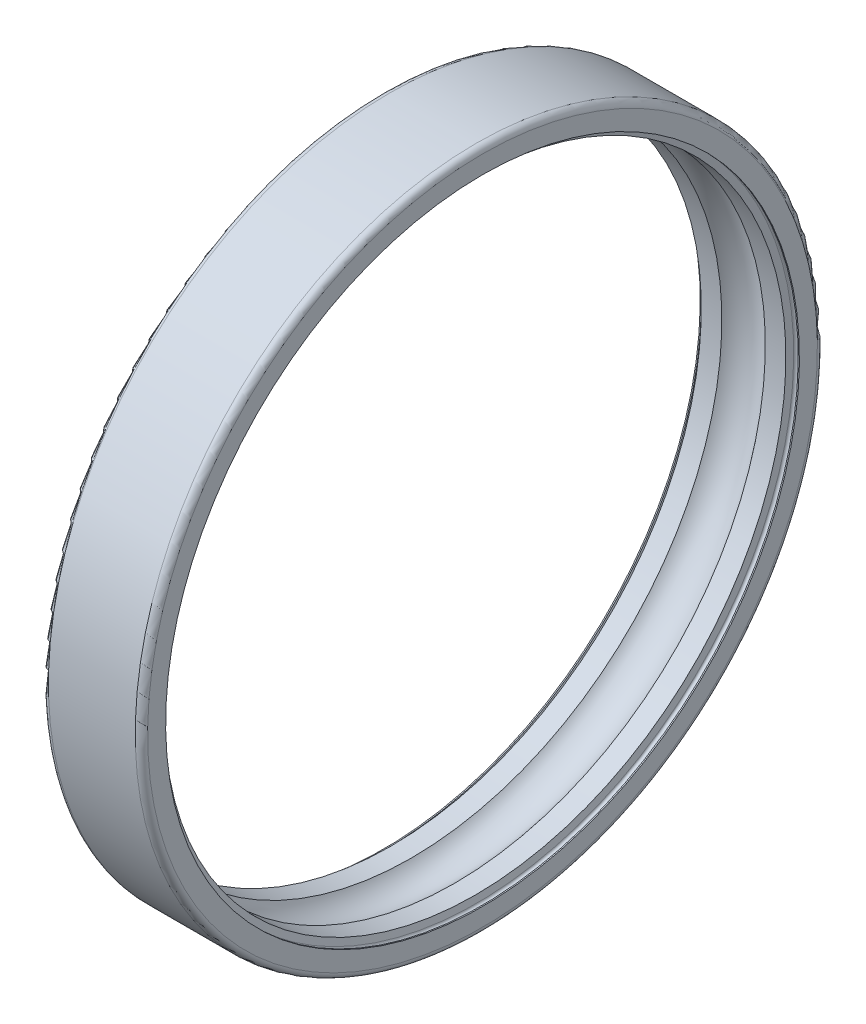
ISO-10303-21;
HEADER;
FILE_DESCRIPTION(('STEP AP214'),'2;1');
FILE_NAME('part.step','',(''),(''),'','','');
FILE_SCHEMA(('AUTOMOTIVE_DESIGN { 1 0 10303 214 1 1 1 1 }'));
ENDSEC;
DATA;
#1=APPLICATION_CONTEXT('core data for automotive mechanical design processes');
#2=APPLICATION_PROTOCOL_DEFINITION('international standard','automotive_design',2000,#1);
#3=PRODUCT_CONTEXT('',#1,'mechanical');
#4=PRODUCT('Part','Part','',(#3));
#5=PRODUCT_RELATED_PRODUCT_CATEGORY('part','',(#4));
#6=PRODUCT_DEFINITION_FORMATION('','',#4);
#7=PRODUCT_DEFINITION_CONTEXT('part definition',#1,'design');
#8=PRODUCT_DEFINITION('design','',#6,#7);
#9=PRODUCT_DEFINITION_SHAPE('','',#8);
#10=(LENGTH_UNIT() NAMED_UNIT(*) SI_UNIT(.MILLI.,.METRE.));
#11=(NAMED_UNIT(*) PLANE_ANGLE_UNIT() SI_UNIT($,.RADIAN.));
#12=(NAMED_UNIT(*) SI_UNIT($,.STERADIAN.) SOLID_ANGLE_UNIT());
#13=UNCERTAINTY_MEASURE_WITH_UNIT(LENGTH_MEASURE(1.E-05),#10,'distance_accuracy_value','');
#14=(GEOMETRIC_REPRESENTATION_CONTEXT(3) GLOBAL_UNCERTAINTY_ASSIGNED_CONTEXT((#13)) GLOBAL_UNIT_ASSIGNED_CONTEXT((#10,
#11,#12)) REPRESENTATION_CONTEXT('',''));
#15=CARTESIAN_POINT('',(0.,0.,0.));
#16=DIRECTION('',(0.,0.,1.));
#17=DIRECTION('',(1.,0.,0.));
#18=AXIS2_PLACEMENT_3D('',#15,#16,#17);
#19=CARTESIAN_POINT('',(15.4,0.,0.));
#20=DIRECTION('',(1.,0.,0.));
#21=DIRECTION('',(0.,0.,-1.));
#22=AXIS2_PLACEMENT_3D('',#19,#20,#21);
#23=TOROIDAL_SURFACE('',#22,51.1,0.4);
#24=CARTESIAN_POINT('',(15.8,0.,0.));
#25=DIRECTION('',(1.,0.,0.));
#26=DIRECTION('',(0.,1.,0.));
#27=AXIS2_PLACEMENT_3D('',#24,#25,#26);
#28=CIRCLE('',#27,51.1);
#29=CARTESIAN_POINT('',(15.8,51.1,0.));
#30=VERTEX_POINT('',#29);
#31=EDGE_CURVE('E10',#30,#30,#28,.T.);
#32=ORIENTED_EDGE('',*,*,#31,.T.);
#33=EDGE_LOOP('',(#32));
#34=FACE_BOUND('',#33,.T.);
#35=CARTESIAN_POINT('',(15.0060768987951,0.,0.));
#36=DIRECTION('',(1.,0.,0.));
#37=DIRECTION('',(0.,1.,0.));
#38=AXIS2_PLACEMENT_3D('',#35,#36,#37);
#39=CIRCLE('',#38,51.1694592710668);
#40=CARTESIAN_POINT('',(15.0060768987951,51.1694592710668,0.));
#41=VERTEX_POINT('',#40);
#42=EDGE_CURVE('E76',#41,#41,#39,.T.);
#43=ORIENTED_EDGE('',*,*,#42,.F.);
#44=EDGE_LOOP('',(#43));
#45=FACE_BOUND('',#44,.T.);
#46=ADVANCED_FACE('F15',(#34,#45),#23,.F.);
#47=CARTESIAN_POINT('',(15.9,0.,0.));
#48=DIRECTION('',(-1.,0.,0.));
#49=DIRECTION('',(0.,1.,0.));
#50=AXIS2_PLACEMENT_3D('',#47,#48,#49);
#51=CYLINDRICAL_SURFACE('',#50,51.1);
#52=CARTESIAN_POINT('',(16.,0.,0.));
#53=DIRECTION('',(1.,0.,0.));
#54=DIRECTION('',(0.,1.,0.));
#55=AXIS2_PLACEMENT_3D('',#52,#53,#54);
#56=CIRCLE('',#55,51.1);
#57=CARTESIAN_POINT('',(16.,51.1,0.));
#58=VERTEX_POINT('',#57);
#59=EDGE_CURVE('E25',#58,#58,#56,.T.);
#60=ORIENTED_EDGE('',*,*,#59,.T.);
#61=EDGE_LOOP('',(#60));
#62=FACE_BOUND('',#61,.T.);
#63=ORIENTED_EDGE('',*,*,#31,.F.);
#64=EDGE_LOOP('',(#63));
#65=FACE_BOUND('',#64,.T.);
#66=ADVANCED_FACE('F115',(#62,#65),#51,.F.);
#67=CARTESIAN_POINT('',(16.,52.55,0.));
#68=DIRECTION('',(1.,0.,0.));
#69=DIRECTION('',(0.,1.,0.));
#70=AXIS2_PLACEMENT_3D('',#67,#68,#69);
#71=PLANE('',#70);
#72=CARTESIAN_POINT('',(16.,0.,0.));
#73=DIRECTION('',(1.,0.,0.));
#74=DIRECTION('',(0.,1.,0.));
#75=AXIS2_PLACEMENT_3D('',#72,#73,#74);
#76=CIRCLE('',#75,54.);
#77=CARTESIAN_POINT('',(16.,54.,0.));
#78=VERTEX_POINT('',#77);
#79=EDGE_CURVE('E89',#78,#78,#76,.T.);
#80=ORIENTED_EDGE('',*,*,#79,.T.);
#81=EDGE_LOOP('',(#80));
#82=FACE_BOUND('',#81,.T.);
#83=ORIENTED_EDGE('',*,*,#59,.F.);
#84=EDGE_LOOP('',(#83));
#85=FACE_BOUND('',#84,.T.);
#86=ADVANCED_FACE('F120',(#82,#85),#71,.T.);
#87=CARTESIAN_POINT('',(15.,0.,0.));
#88=DIRECTION('',(1.,0.,0.));
#89=DIRECTION('',(0.,0.,-1.));
#90=AXIS2_PLACEMENT_3D('',#87,#88,#89);
#91=TOROIDAL_SURFACE('',#90,54.,1.);
#92=CARTESIAN_POINT('',(15.,0.,0.));
#93=DIRECTION('',(1.,0.,0.));
#94=DIRECTION('',(0.,1.,0.));
#95=AXIS2_PLACEMENT_3D('',#92,#93,#94);
#96=CIRCLE('',#95,55.);
#97=CARTESIAN_POINT('',(15.,55.,0.));
#98=VERTEX_POINT('',#97);
#99=EDGE_CURVE('E19',#98,#98,#96,.T.);
#100=ORIENTED_EDGE('',*,*,#99,.T.);
#101=EDGE_LOOP('',(#100));
#102=FACE_BOUND('',#101,.T.);
#103=ORIENTED_EDGE('',*,*,#79,.F.);
#104=EDGE_LOOP('',(#103));
#105=FACE_BOUND('',#104,.T.);
#106=ADVANCED_FACE('F133',(#102,#105),#91,.T.);
#107=CARTESIAN_POINT('',(8.,0.,0.));
#108=DIRECTION('',(-1.,0.,0.));
#109=DIRECTION('',(0.,1.,0.));
#110=AXIS2_PLACEMENT_3D('',#107,#108,#109);
#111=CYLINDRICAL_SURFACE('',#110,55.);
#112=CARTESIAN_POINT('',(1.,0.,0.));
#113=DIRECTION('',(1.,0.,0.));
#114=DIRECTION('',(0.,1.,0.));
#115=AXIS2_PLACEMENT_3D('',#112,#113,#114);
#116=CIRCLE('',#115,55.);
#117=CARTESIAN_POINT('',(1.,55.,0.));
#118=VERTEX_POINT('',#117);
#119=EDGE_CURVE('E83',#118,#118,#116,.T.);
#120=ORIENTED_EDGE('',*,*,#119,.T.);
#121=EDGE_LOOP('',(#120));
#122=FACE_BOUND('',#121,.T.);
#123=ORIENTED_EDGE('',*,*,#99,.F.);
#124=EDGE_LOOP('',(#123));
#125=FACE_BOUND('',#124,.T.);
#126=ADVANCED_FACE('F17',(#122,#125),#111,.T.);
#127=CARTESIAN_POINT('',(1.,0.,0.));
#128=DIRECTION('',(1.,0.,0.));
#129=DIRECTION('',(0.,0.,-1.));
#130=AXIS2_PLACEMENT_3D('',#127,#128,#129);
#131=TOROIDAL_SURFACE('',#130,54.,1.);
#132=CARTESIAN_POINT('',(0.,0.,0.));
#133=DIRECTION('',(1.,0.,0.));
#134=DIRECTION('',(0.,1.,0.));
#135=AXIS2_PLACEMENT_3D('',#132,#133,#134);
#136=CIRCLE('',#135,54.);
#137=CARTESIAN_POINT('',(0.,54.,0.));
#138=VERTEX_POINT('',#137);
#139=EDGE_CURVE('E85',#138,#138,#136,.T.);
#140=ORIENTED_EDGE('',*,*,#139,.T.);
#141=EDGE_LOOP('',(#140));
#142=FACE_BOUND('',#141,.T.);
#143=ORIENTED_EDGE('',*,*,#119,.F.);
#144=EDGE_LOOP('',(#143));
#145=FACE_BOUND('',#144,.T.);
#146=ADVANCED_FACE('F126',(#142,#145),#131,.T.);
#147=CARTESIAN_POINT('',(0.,52.55,0.));
#148=DIRECTION('',(-1.,0.,0.));
#149=DIRECTION('',(0.,-1.,0.));
#150=AXIS2_PLACEMENT_3D('',#147,#148,#149);
#151=PLANE('',#150);
#152=CARTESIAN_POINT('',(0.,0.,0.));
#153=DIRECTION('',(1.,0.,0.));
#154=DIRECTION('',(0.,1.,0.));
#155=AXIS2_PLACEMENT_3D('',#152,#153,#154);
#156=CIRCLE('',#155,51.1);
#157=CARTESIAN_POINT('',(0.,51.1,0.));
#158=VERTEX_POINT('',#157);
#159=EDGE_CURVE('E88',#158,#158,#156,.T.);
#160=ORIENTED_EDGE('',*,*,#159,.T.);
#161=EDGE_LOOP('',(#160));
#162=FACE_BOUND('',#161,.T.);
#163=ORIENTED_EDGE('',*,*,#139,.F.);
#164=EDGE_LOOP('',(#163));
#165=FACE_BOUND('',#164,.T.);
#166=ADVANCED_FACE('F110',(#162,#165),#151,.T.);
#167=CARTESIAN_POINT('',(0.1,0.,0.));
#168=DIRECTION('',(-1.,0.,0.));
#169=DIRECTION('',(0.,1.,0.));
#170=AXIS2_PLACEMENT_3D('',#167,#168,#169);
#171=CYLINDRICAL_SURFACE('',#170,51.1);
#172=CARTESIAN_POINT('',(0.2,0.,0.));
#173=DIRECTION('',(1.,0.,0.));
#174=DIRECTION('',(0.,1.,0.));
#175=AXIS2_PLACEMENT_3D('',#172,#173,#174);
#176=CIRCLE('',#175,51.1);
#177=CARTESIAN_POINT('',(0.2,51.1,0.));
#178=VERTEX_POINT('',#177);
#179=EDGE_CURVE('E80',#178,#178,#176,.T.);
#180=ORIENTED_EDGE('',*,*,#179,.T.);
#181=EDGE_LOOP('',(#180));
#182=FACE_BOUND('',#181,.T.);
#183=ORIENTED_EDGE('',*,*,#159,.F.);
#184=EDGE_LOOP('',(#183));
#185=FACE_BOUND('',#184,.T.);
#186=ADVANCED_FACE('F95',(#182,#185),#171,.F.);
#187=CARTESIAN_POINT('',(0.6,0.,0.));
#188=DIRECTION('',(1.,0.,0.));
#189=DIRECTION('',(0.,0.,-1.));
#190=AXIS2_PLACEMENT_3D('',#187,#188,#189);
#191=TOROIDAL_SURFACE('',#190,51.1,0.4);
#192=CARTESIAN_POINT('',(0.993923101204883,0.,0.));
#193=DIRECTION('',(1.,0.,0.));
#194=DIRECTION('',(0.,1.,0.));
#195=AXIS2_PLACEMENT_3D('',#192,#193,#194);
#196=CIRCLE('',#195,51.1694592710668);
#197=CARTESIAN_POINT('',(0.993923101204883,51.1694592710668,0.));
#198=VERTEX_POINT('',#197);
#199=EDGE_CURVE('E74',#198,#198,#196,.T.);
#200=ORIENTED_EDGE('',*,*,#199,.T.);
#201=EDGE_LOOP('',(#200));
#202=FACE_BOUND('',#201,.T.);
#203=ORIENTED_EDGE('',*,*,#179,.F.);
#204=EDGE_LOOP('',(#203));
#205=FACE_BOUND('',#204,.T.);
#206=ADVANCED_FACE('F98',(#202,#205),#191,.F.);
#207=CARTESIAN_POINT('',(1.08821036333382,0.,0.));
#208=DIRECTION('',(-1.,0.,0.));
#209=DIRECTION('',(0.,1.,0.));
#210=AXIS2_PLACEMENT_3D('',#207,#208,#209);
#211=CONICAL_SURFACE('',#210,50.6347296355334,1.39626340159546);
#212=CARTESIAN_POINT('',(1.18249762546276,0.,0.));
#213=DIRECTION('',(1.,0.,0.));
#214=DIRECTION('',(0.,1.,0.));
#215=AXIS2_PLACEMENT_3D('',#212,#213,#214);
#216=CIRCLE('',#215,50.1);
#217=CARTESIAN_POINT('',(1.18249762546276,50.1,0.));
#218=VERTEX_POINT('',#217);
#219=EDGE_CURVE('E71',#218,#218,#216,.T.);
#220=ORIENTED_EDGE('',*,*,#219,.T.);
#221=EDGE_LOOP('',(#220));
#222=FACE_BOUND('',#221,.T.);
#223=ORIENTED_EDGE('',*,*,#199,.F.);
#224=EDGE_LOOP('',(#223));
#225=FACE_BOUND('',#224,.T.);
#226=ADVANCED_FACE('F100',(#222,#225),#211,.F.);
#227=CARTESIAN_POINT('',(2.83785280426667,0.,0.));
#228=DIRECTION('',(-1.,0.,0.));
#229=DIRECTION('',(0.,1.,0.));
#230=AXIS2_PLACEMENT_3D('',#227,#228,#229);
#231=CYLINDRICAL_SURFACE('',#230,50.1);
#232=CARTESIAN_POINT('',(4.49320798307058,0.,0.));
#233=DIRECTION('',(1.,0.,0.));
#234=DIRECTION('',(0.,1.,0.));
#235=AXIS2_PLACEMENT_3D('',#232,#233,#234);
#236=CIRCLE('',#235,50.1);
#237=CARTESIAN_POINT('',(4.49320798307058,50.1,0.));
#238=VERTEX_POINT('',#237);
#239=EDGE_CURVE('E67',#238,#238,#236,.T.);
#240=ORIENTED_EDGE('',*,*,#239,.T.);
#241=EDGE_LOOP('',(#240));
#242=FACE_BOUND('',#241,.T.);
#243=ORIENTED_EDGE('',*,*,#219,.F.);
#244=EDGE_LOOP('',(#243));
#245=FACE_BOUND('',#244,.T.);
#246=ADVANCED_FACE('F68',(#242,#245),#231,.F.);
#247=CARTESIAN_POINT('',(8.,0.,0.));
#248=DIRECTION('',(1.,0.,0.));
#249=DIRECTION('',(0.,0.,-1.));
#250=AXIS2_PLACEMENT_3D('',#247,#248,#249);
#251=TOROIDAL_SURFACE('',#250,47.5,4.3655);
#252=CARTESIAN_POINT('',(11.5067920169294,0.,0.));
#253=DIRECTION('',(1.,0.,0.));
#254=DIRECTION('',(0.,1.,0.));
#255=AXIS2_PLACEMENT_3D('',#252,#253,#254);
#256=CIRCLE('',#255,50.1);
#257=CARTESIAN_POINT('',(11.5067920169294,50.1,0.));
#258=VERTEX_POINT('',#257);
#259=EDGE_CURVE('E72',#258,#258,#256,.T.);
#260=ORIENTED_EDGE('',*,*,#259,.T.);
#261=EDGE_LOOP('',(#260));
#262=FACE_BOUND('',#261,.T.);
#263=ORIENTED_EDGE('',*,*,#239,.F.);
#264=EDGE_LOOP('',(#263));
#265=FACE_BOUND('',#264,.T.);
#266=ADVANCED_FACE('F131',(#262,#265),#251,.F.);
#267=CARTESIAN_POINT('',(13.1621471957333,0.,0.));
#268=DIRECTION('',(-1.,0.,0.));
#269=DIRECTION('',(0.,1.,0.));
#270=AXIS2_PLACEMENT_3D('',#267,#268,#269);
#271=CYLINDRICAL_SURFACE('',#270,50.1);
#272=CARTESIAN_POINT('',(14.8175023745372,0.,0.));
#273=DIRECTION('',(1.,0.,0.));
#274=DIRECTION('',(0.,1.,0.));
#275=AXIS2_PLACEMENT_3D('',#272,#273,#274);
#276=CIRCLE('',#275,50.1);
#277=CARTESIAN_POINT('',(14.8175023745372,50.1,0.));
#278=VERTEX_POINT('',#277);
#279=EDGE_CURVE('E81',#278,#278,#276,.T.);
#280=ORIENTED_EDGE('',*,*,#279,.T.);
#281=EDGE_LOOP('',(#280));
#282=FACE_BOUND('',#281,.T.);
#283=ORIENTED_EDGE('',*,*,#259,.F.);
#284=EDGE_LOOP('',(#283));
#285=FACE_BOUND('',#284,.T.);
#286=ADVANCED_FACE('F128',(#282,#285),#271,.F.);
#287=CARTESIAN_POINT('',(14.9117896366662,0.,0.));
#288=DIRECTION('',(1.,0.,0.));
#289=DIRECTION('',(0.,1.,0.));
#290=AXIS2_PLACEMENT_3D('',#287,#288,#289);
#291=CONICAL_SURFACE('',#290,50.6347296355334,1.39626340159546);
#292=ORIENTED_EDGE('',*,*,#42,.T.);
#293=EDGE_LOOP('',(#292));
#294=FACE_BOUND('',#293,.T.);
#295=ORIENTED_EDGE('',*,*,#279,.F.);
#296=EDGE_LOOP('',(#295));
#297=FACE_BOUND('',#296,.T.);
#298=ADVANCED_FACE('F130',(#294,#297),#291,.F.);
#299=CLOSED_SHELL('',(#46,#66,#86,#106,#126,#146,#166,#186,#206,#226,#246,#266,#286,#298));
#300=MANIFOLD_SOLID_BREP('B1',#299);
#301=ADVANCED_BREP_SHAPE_REPRESENTATION('',(#18,#300),#14);
#302=SHAPE_DEFINITION_REPRESENTATION(#9,#301);
ENDSEC;
END-ISO-10303-21;
